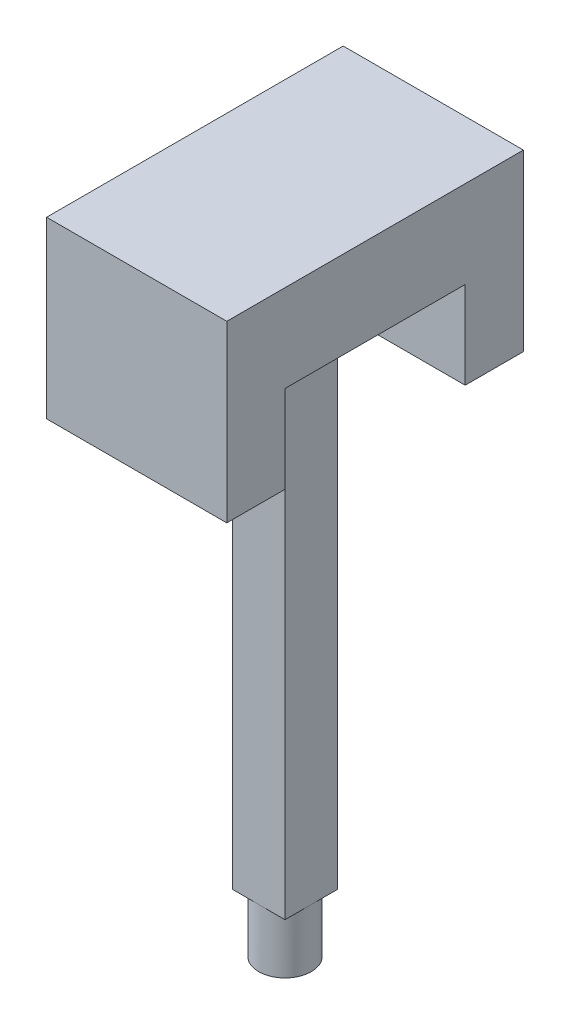
ISO-10303-21;
HEADER;
FILE_DESCRIPTION(('STEP AP214'),'2;1');
FILE_NAME('part.step','',(''),(''),'','','');
FILE_SCHEMA(('AUTOMOTIVE_DESIGN { 1 0 10303 214 1 1 1 1 }'));
ENDSEC;
DATA;
#1=APPLICATION_CONTEXT('core data for automotive mechanical design processes');
#2=APPLICATION_PROTOCOL_DEFINITION('international standard','automotive_design',2000,#1);
#3=PRODUCT_CONTEXT('',#1,'mechanical');
#4=PRODUCT('Part','Part','',(#3));
#5=PRODUCT_RELATED_PRODUCT_CATEGORY('part','',(#4));
#6=PRODUCT_DEFINITION_FORMATION('','',#4);
#7=PRODUCT_DEFINITION_CONTEXT('part definition',#1,'design');
#8=PRODUCT_DEFINITION('design','',#6,#7);
#9=PRODUCT_DEFINITION_SHAPE('','',#8);
#10=(LENGTH_UNIT() NAMED_UNIT(*) SI_UNIT(.MILLI.,.METRE.));
#11=(NAMED_UNIT(*) PLANE_ANGLE_UNIT() SI_UNIT($,.RADIAN.));
#12=(NAMED_UNIT(*) SI_UNIT($,.STERADIAN.) SOLID_ANGLE_UNIT());
#13=UNCERTAINTY_MEASURE_WITH_UNIT(LENGTH_MEASURE(1.E-05),#10,'distance_accuracy_value','');
#14=(GEOMETRIC_REPRESENTATION_CONTEXT(3) GLOBAL_UNCERTAINTY_ASSIGNED_CONTEXT((#13)) GLOBAL_UNIT_ASSIGNED_CONTEXT((#10,
#11,#12)) REPRESENTATION_CONTEXT('',''));
#15=CARTESIAN_POINT('',(0.,0.,0.));
#16=DIRECTION('',(0.,0.,1.));
#17=DIRECTION('',(1.,0.,0.));
#18=AXIS2_PLACEMENT_3D('',#15,#16,#17);
#19=CARTESIAN_POINT('',(0.,15.,0.));
#20=DIRECTION('',(0.,1.,0.));
#21=DIRECTION('',(0.,0.,1.));
#22=AXIS2_PLACEMENT_3D('',#19,#20,#21);
#23=PLANE('',#22);
#24=DIRECTION('',(1.,0.,0.));
#25=VECTOR('',#24,1.);
#26=CARTESIAN_POINT('',(-0.753333333333334,15.,-0.753333333333334));
#27=LINE('',#26,#25);
#28=CARTESIAN_POINT('',(-0.753333333333334,15.,-0.753333333333334));
#29=VERTEX_POINT('',#28);
#30=CARTESIAN_POINT('',(0.753333333333333,15.,-0.753333333333334));
#31=VERTEX_POINT('',#30);
#32=EDGE_CURVE('E230',#29,#31,#27,.T.);
#33=ORIENTED_EDGE('',*,*,#32,.F.);
#34=DIRECTION('',(0.,0.,1.));
#35=VECTOR('',#34,1.);
#36=CARTESIAN_POINT('',(-0.753333333333334,15.,-0.753333333333334));
#37=LINE('',#36,#35);
#38=CARTESIAN_POINT('',(-0.753333333333333,15.,0.753333333333333));
#39=VERTEX_POINT('',#38);
#40=EDGE_CURVE('E222',#29,#39,#37,.T.);
#41=ORIENTED_EDGE('',*,*,#40,.T.);
#42=DIRECTION('',(1.,0.,0.));
#43=VECTOR('',#42,1.);
#44=CARTESIAN_POINT('',(-0.753333333333333,15.,0.753333333333333));
#45=LINE('',#44,#43);
#46=CARTESIAN_POINT('',(0.753333333333333,15.,0.753333333333333));
#47=VERTEX_POINT('',#46);
#48=EDGE_CURVE('E224',#39,#47,#45,.T.);
#49=ORIENTED_EDGE('',*,*,#48,.T.);
#50=DIRECTION('',(0.,0.,1.));
#51=VECTOR('',#50,1.);
#52=CARTESIAN_POINT('',(0.753333333333333,15.,-0.753333333333334));
#53=LINE('',#52,#51);
#54=EDGE_CURVE('E227',#31,#47,#53,.T.);
#55=ORIENTED_EDGE('',*,*,#54,.F.);
#56=EDGE_LOOP('',(#33,#41,#49,#55));
#57=FACE_BOUND('',#56,.T.);
#58=DIRECTION('',(0.,0.,-1.));
#59=VECTOR('',#58,1.);
#60=CARTESIAN_POINT('',(-2.58,15.,0.));
#61=LINE('',#60,#59);
#62=CARTESIAN_POINT('',(-2.58,15.,2.58));
#63=VERTEX_POINT('',#62);
#64=CARTESIAN_POINT('',(-2.58,15.,-2.58));
#65=VERTEX_POINT('',#64);
#66=EDGE_CURVE('E63',#63,#65,#61,.T.);
#67=ORIENTED_EDGE('',*,*,#66,.T.);
#68=DIRECTION('',(1.,0.,0.));
#69=VECTOR('',#68,1.);
#70=CARTESIAN_POINT('',(0.,15.,-2.58));
#71=LINE('',#70,#69);
#72=CARTESIAN_POINT('',(2.58,15.,-2.58));
#73=VERTEX_POINT('',#72);
#74=EDGE_CURVE('E68',#65,#73,#71,.T.);
#75=ORIENTED_EDGE('',*,*,#74,.T.);
#76=DIRECTION('',(0.,0.,-1.));
#77=VECTOR('',#76,1.);
#78=CARTESIAN_POINT('',(2.58,15.,0.));
#79=LINE('',#78,#77);
#80=CARTESIAN_POINT('',(2.58,15.,2.58));
#81=VERTEX_POINT('',#80);
#82=EDGE_CURVE('E155',#81,#73,#79,.T.);
#83=ORIENTED_EDGE('',*,*,#82,.F.);
#84=DIRECTION('',(1.,0.,0.));
#85=VECTOR('',#84,1.);
#86=CARTESIAN_POINT('',(0.,15.,2.58));
#87=LINE('',#86,#85);
#88=EDGE_CURVE('E183',#63,#81,#87,.T.);
#89=ORIENTED_EDGE('',*,*,#88,.F.);
#90=EDGE_LOOP('',(#67,#75,#83,#89));
#91=FACE_BOUND('',#90,.T.);
#92=ADVANCED_FACE('F45',(#57,#91),#23,.F.);
#93=CARTESIAN_POINT('',(0.,0.,0.));
#94=DIRECTION('',(0.,1.,0.));
#95=DIRECTION('',(0.,0.,1.));
#96=AXIS2_PLACEMENT_3D('',#93,#94,#95);
#97=PLANE('',#96);
#98=CARTESIAN_POINT('',(0.,0.,0.));
#99=DIRECTION('',(0.,-1.,0.));
#100=DIRECTION('',(0.,0.,-1.));
#101=AXIS2_PLACEMENT_3D('',#98,#99,#100);
#102=CIRCLE('',#101,0.753333333333333);
#103=CARTESIAN_POINT('',(0.,0.,-0.753333333333333));
#104=VERTEX_POINT('',#103);
#105=CARTESIAN_POINT('',(0.753333333333333,0.,0.));
#106=VERTEX_POINT('',#105);
#107=EDGE_CURVE('E56',#104,#106,#102,.T.);
#108=ORIENTED_EDGE('',*,*,#107,.F.);
#109=DIRECTION('',(1.,0.,0.));
#110=VECTOR('',#109,1.);
#111=CARTESIAN_POINT('',(-0.753333333333334,0.,-0.753333333333334));
#112=LINE('',#111,#110);
#113=CARTESIAN_POINT('',(0.753333333333333,0.,-0.753333333333334));
#114=VERTEX_POINT('',#113);
#115=EDGE_CURVE('E245',#104,#114,#112,.T.);
#116=ORIENTED_EDGE('',*,*,#115,.T.);
#117=DIRECTION('',(0.,0.,1.));
#118=VECTOR('',#117,1.);
#119=CARTESIAN_POINT('',(0.753333333333333,0.,-0.753333333333334));
#120=LINE('',#119,#118);
#121=EDGE_CURVE('E242',#114,#106,#120,.T.);
#122=ORIENTED_EDGE('',*,*,#121,.T.);
#123=EDGE_LOOP('',(#108,#116,#122));
#124=FACE_BOUND('',#123,.T.);
#125=ADVANCED_FACE('F282',(#124),#97,.F.);
#126=CARTESIAN_POINT('',(0.,0.,0.753333333333333));
#127=VERTEX_POINT('',#126);
#128=EDGE_CURVE('E11',#106,#127,#102,.T.);
#129=ORIENTED_EDGE('',*,*,#128,.F.);
#130=CARTESIAN_POINT('',(0.753333333333333,0.,0.753333333333333));
#131=VERTEX_POINT('',#130);
#132=EDGE_CURVE('E241',#106,#131,#120,.T.);
#133=ORIENTED_EDGE('',*,*,#132,.T.);
#134=DIRECTION('',(1.,0.,0.));
#135=VECTOR('',#134,1.);
#136=CARTESIAN_POINT('',(-0.753333333333333,0.,0.753333333333333));
#137=LINE('',#136,#135);
#138=EDGE_CURVE('E237',#127,#131,#137,.T.);
#139=ORIENTED_EDGE('',*,*,#138,.F.);
#140=EDGE_LOOP('',(#129,#133,#139));
#141=FACE_BOUND('',#140,.T.);
#142=ADVANCED_FACE('F270',(#141),#97,.F.);
#143=CARTESIAN_POINT('',(-0.753333333333333,0.,0.));
#144=VERTEX_POINT('',#143);
#145=EDGE_CURVE('E54',#127,#144,#102,.T.);
#146=ORIENTED_EDGE('',*,*,#145,.F.);
#147=CARTESIAN_POINT('',(-0.753333333333333,0.,0.753333333333333));
#148=VERTEX_POINT('',#147);
#149=EDGE_CURVE('E238',#148,#127,#137,.T.);
#150=ORIENTED_EDGE('',*,*,#149,.F.);
#151=DIRECTION('',(0.,0.,1.));
#152=VECTOR('',#151,1.);
#153=CARTESIAN_POINT('',(-0.753333333333334,0.,-0.753333333333334));
#154=LINE('',#153,#152);
#155=EDGE_CURVE('E218',#144,#148,#154,.T.);
#156=ORIENTED_EDGE('',*,*,#155,.F.);
#157=EDGE_LOOP('',(#146,#150,#156));
#158=FACE_BOUND('',#157,.T.);
#159=ADVANCED_FACE('F267',(#158),#97,.F.);
#160=CARTESIAN_POINT('',(-0.753333333333334,15.,-0.753333333333334));
#161=DIRECTION('',(1.,0.,0.));
#162=DIRECTION('',(0.,0.,-1.));
#163=AXIS2_PLACEMENT_3D('',#160,#161,#162);
#164=PLANE('',#163);
#165=CARTESIAN_POINT('',(-0.753333333333334,0.,-0.753333333333334));
#166=VERTEX_POINT('',#165);
#167=EDGE_CURVE('E234',#166,#144,#154,.T.);
#168=ORIENTED_EDGE('',*,*,#167,.T.);
#169=ORIENTED_EDGE('',*,*,#155,.T.);
#170=DIRECTION('',(0.,-1.,0.));
#171=VECTOR('',#170,1.);
#172=CARTESIAN_POINT('',(-0.753333333333333,15.,0.753333333333333));
#173=LINE('',#172,#171);
#174=EDGE_CURVE('E49',#39,#148,#173,.T.);
#175=ORIENTED_EDGE('',*,*,#174,.F.);
#176=ORIENTED_EDGE('',*,*,#40,.F.);
#177=DIRECTION('',(0.,-1.,0.));
#178=VECTOR('',#177,1.);
#179=CARTESIAN_POINT('',(-0.753333333333334,15.,-0.753333333333334));
#180=LINE('',#179,#178);
#181=EDGE_CURVE('E233',#29,#166,#180,.T.);
#182=ORIENTED_EDGE('',*,*,#181,.T.);
#183=EDGE_LOOP('',(#168,#169,#175,#176,#182));
#184=FACE_BOUND('',#183,.T.);
#185=ADVANCED_FACE('F47',(#184),#164,.F.);
#186=CARTESIAN_POINT('',(-0.753333333333333,15.,0.753333333333333));
#187=DIRECTION('',(0.,0.,-1.));
#188=DIRECTION('',(-1.,0.,0.));
#189=AXIS2_PLACEMENT_3D('',#186,#187,#188);
#190=PLANE('',#189);
#191=ORIENTED_EDGE('',*,*,#149,.T.);
#192=ORIENTED_EDGE('',*,*,#138,.T.);
#193=DIRECTION('',(0.,-1.,0.));
#194=VECTOR('',#193,1.);
#195=CARTESIAN_POINT('',(0.753333333333333,15.,0.753333333333333));
#196=LINE('',#195,#194);
#197=EDGE_CURVE('E250',#47,#131,#196,.T.);
#198=ORIENTED_EDGE('',*,*,#197,.F.);
#199=ORIENTED_EDGE('',*,*,#48,.F.);
#200=ORIENTED_EDGE('',*,*,#174,.T.);
#201=EDGE_LOOP('',(#191,#192,#198,#199,#200));
#202=FACE_BOUND('',#201,.T.);
#203=ADVANCED_FACE('F271',(#202),#190,.F.);
#204=CARTESIAN_POINT('',(0.753333333333333,15.,-0.753333333333334));
#205=DIRECTION('',(1.,0.,0.));
#206=DIRECTION('',(0.,0.,-1.));
#207=AXIS2_PLACEMENT_3D('',#204,#205,#206);
#208=PLANE('',#207);
#209=ORIENTED_EDGE('',*,*,#121,.F.);
#210=DIRECTION('',(0.,-1.,0.));
#211=VECTOR('',#210,1.);
#212=CARTESIAN_POINT('',(0.753333333333333,15.,-0.753333333333334));
#213=LINE('',#212,#211);
#214=EDGE_CURVE('E248',#31,#114,#213,.T.);
#215=ORIENTED_EDGE('',*,*,#214,.F.);
#216=ORIENTED_EDGE('',*,*,#54,.T.);
#217=ORIENTED_EDGE('',*,*,#197,.T.);
#218=ORIENTED_EDGE('',*,*,#132,.F.);
#219=EDGE_LOOP('',(#209,#215,#216,#217,#218));
#220=FACE_BOUND('',#219,.T.);
#221=ADVANCED_FACE('F273',(#220),#208,.T.);
#222=CARTESIAN_POINT('',(-0.753333333333334,15.,-0.753333333333334));
#223=DIRECTION('',(0.,0.,-1.));
#224=DIRECTION('',(-1.,0.,0.));
#225=AXIS2_PLACEMENT_3D('',#222,#223,#224);
#226=PLANE('',#225);
#227=EDGE_CURVE('E225',#166,#104,#112,.T.);
#228=ORIENTED_EDGE('',*,*,#227,.F.);
#229=ORIENTED_EDGE('',*,*,#181,.F.);
#230=ORIENTED_EDGE('',*,*,#32,.T.);
#231=ORIENTED_EDGE('',*,*,#214,.T.);
#232=ORIENTED_EDGE('',*,*,#115,.F.);
#233=EDGE_LOOP('',(#228,#229,#230,#231,#232));
#234=FACE_BOUND('',#233,.T.);
#235=ADVANCED_FACE('F278',(#234),#226,.T.);
#236=EDGE_CURVE('E221',#144,#104,#102,.T.);
#237=ORIENTED_EDGE('',*,*,#236,.F.);
#238=ORIENTED_EDGE('',*,*,#167,.F.);
#239=ORIENTED_EDGE('',*,*,#227,.T.);
#240=EDGE_LOOP('',(#237,#238,#239));
#241=FACE_BOUND('',#240,.T.);
#242=ADVANCED_FACE('F292',(#241),#97,.F.);
#243=CARTESIAN_POINT('',(0.,-1.66666666666667,0.));
#244=DIRECTION('',(0.,1.,0.));
#245=DIRECTION('',(0.,0.,1.));
#246=AXIS2_PLACEMENT_3D('',#243,#244,#245);
#247=CYLINDRICAL_SURFACE('',#246,0.753333333333333);
#248=CARTESIAN_POINT('',(0.,-1.66666666666667,0.));
#249=DIRECTION('',(0.,-1.,0.));
#250=DIRECTION('',(0.,0.,-1.));
#251=AXIS2_PLACEMENT_3D('',#248,#249,#250);
#252=CIRCLE('',#251,0.753333333333333);
#253=CARTESIAN_POINT('',(0.,-1.66666666666667,-0.753333333333333));
#254=VERTEX_POINT('',#253);
#255=EDGE_CURVE('E216',#254,#254,#252,.T.);
#256=ORIENTED_EDGE('',*,*,#255,.F.);
#257=EDGE_LOOP('',(#256));
#258=FACE_BOUND('',#257,.T.);
#259=ORIENTED_EDGE('',*,*,#107,.T.);
#260=ORIENTED_EDGE('',*,*,#128,.T.);
#261=ORIENTED_EDGE('',*,*,#145,.T.);
#262=ORIENTED_EDGE('',*,*,#236,.T.);
#263=EDGE_LOOP('',(#259,#260,#261,#262));
#264=FACE_BOUND('',#263,.T.);
#265=ADVANCED_FACE('F262',(#258,#264),#247,.T.);
#266=CARTESIAN_POINT('',(0.,-1.66666666666667,0.));
#267=DIRECTION('',(0.,-1.,0.));
#268=DIRECTION('',(0.,0.,-1.));
#269=AXIS2_PLACEMENT_3D('',#266,#267,#268);
#270=PLANE('',#269);
#271=ORIENTED_EDGE('',*,*,#255,.T.);
#272=EDGE_LOOP('',(#271));
#273=FACE_BOUND('',#272,.T.);
#274=ADVANCED_FACE('F309',(#273),#270,.T.);
#275=CARTESIAN_POINT('',(-2.58,17.5,0.));
#276=DIRECTION('',(-1.,0.,0.));
#277=DIRECTION('',(0.,0.,1.));
#278=AXIS2_PLACEMENT_3D('',#275,#276,#277);
#279=PLANE('',#278);
#280=ORIENTED_EDGE('',*,*,#66,.F.);
#281=DIRECTION('',(0.,1.,0.));
#282=VECTOR('',#281,1.);
#283=CARTESIAN_POINT('',(-2.58,12.5,2.58));
#284=LINE('',#283,#282);
#285=CARTESIAN_POINT('',(-2.58,12.5,2.58));
#286=VERTEX_POINT('',#285);
#287=EDGE_CURVE('E173',#286,#63,#284,.T.);
#288=ORIENTED_EDGE('',*,*,#287,.F.);
#289=DIRECTION('',(0.,0.,1.));
#290=VECTOR('',#289,1.);
#291=CARTESIAN_POINT('',(-2.58,12.5,0.));
#292=LINE('',#291,#290);
#293=CARTESIAN_POINT('',(-2.58,12.5,4.24666666666667));
#294=VERTEX_POINT('',#293);
#295=EDGE_CURVE('E185',#286,#294,#292,.T.);
#296=ORIENTED_EDGE('',*,*,#295,.T.);
#297=DIRECTION('',(0.,-1.,0.));
#298=VECTOR('',#297,1.);
#299=CARTESIAN_POINT('',(-2.58,17.5,4.24666666666667));
#300=LINE('',#299,#298);
#301=CARTESIAN_POINT('',(-2.58,17.5,4.24666666666667));
#302=VERTEX_POINT('',#301);
#303=EDGE_CURVE('E214',#302,#294,#300,.T.);
#304=ORIENTED_EDGE('',*,*,#303,.F.);
#305=DIRECTION('',(0.,0.,-1.));
#306=VECTOR('',#305,1.);
#307=CARTESIAN_POINT('',(-2.58,17.5,0.));
#308=LINE('',#307,#306);
#309=CARTESIAN_POINT('',(-2.58,17.5,-4.24666666666667));
#310=VERTEX_POINT('',#309);
#311=EDGE_CURVE('E196',#302,#310,#308,.T.);
#312=ORIENTED_EDGE('',*,*,#311,.T.);
#313=DIRECTION('',(0.,-1.,0.));
#314=VECTOR('',#313,1.);
#315=CARTESIAN_POINT('',(-2.58,17.5,-4.24666666666667));
#316=LINE('',#315,#314);
#317=CARTESIAN_POINT('',(-2.58,12.5,-4.24666666666667));
#318=VERTEX_POINT('',#317);
#319=EDGE_CURVE('E206',#310,#318,#316,.T.);
#320=ORIENTED_EDGE('',*,*,#319,.T.);
#321=DIRECTION('',(0.,0.,-1.));
#322=VECTOR('',#321,1.);
#323=CARTESIAN_POINT('',(-2.58,12.5,0.));
#324=LINE('',#323,#322);
#325=CARTESIAN_POINT('',(-2.58,12.5,-2.58));
#326=VERTEX_POINT('',#325);
#327=EDGE_CURVE('E159',#326,#318,#324,.T.);
#328=ORIENTED_EDGE('',*,*,#327,.F.);
#329=DIRECTION('',(0.,1.,0.));
#330=VECTOR('',#329,1.);
#331=CARTESIAN_POINT('',(-2.58,12.5,-2.58));
#332=LINE('',#331,#330);
#333=EDGE_CURVE('E158',#326,#65,#332,.T.);
#334=ORIENTED_EDGE('',*,*,#333,.T.);
#335=EDGE_LOOP('',(#280,#288,#296,#304,#312,#320,#328,#334));
#336=FACE_BOUND('',#335,.T.);
#337=ADVANCED_FACE('F306',(#336),#279,.T.);
#338=CARTESIAN_POINT('',(0.,17.5,4.24666666666667));
#339=DIRECTION('',(0.,0.,-1.));
#340=DIRECTION('',(-1.,0.,0.));
#341=AXIS2_PLACEMENT_3D('',#338,#339,#340);
#342=PLANE('',#341);
#343=ORIENTED_EDGE('',*,*,#303,.T.);
#344=DIRECTION('',(1.,0.,0.));
#345=VECTOR('',#344,1.);
#346=CARTESIAN_POINT('',(0.,12.5,4.24666666666667));
#347=LINE('',#346,#345);
#348=CARTESIAN_POINT('',(2.58,12.5,4.24666666666667));
#349=VERTEX_POINT('',#348);
#350=EDGE_CURVE('E188',#294,#349,#347,.T.);
#351=ORIENTED_EDGE('',*,*,#350,.T.);
#352=DIRECTION('',(0.,-1.,0.));
#353=VECTOR('',#352,1.);
#354=CARTESIAN_POINT('',(2.58,17.5,4.24666666666667));
#355=LINE('',#354,#353);
#356=CARTESIAN_POINT('',(2.58,17.5,4.24666666666667));
#357=VERTEX_POINT('',#356);
#358=EDGE_CURVE('E212',#357,#349,#355,.T.);
#359=ORIENTED_EDGE('',*,*,#358,.F.);
#360=DIRECTION('',(1.,0.,0.));
#361=VECTOR('',#360,1.);
#362=CARTESIAN_POINT('',(0.,17.5,4.24666666666667));
#363=LINE('',#362,#361);
#364=EDGE_CURVE('E199',#302,#357,#363,.T.);
#365=ORIENTED_EDGE('',*,*,#364,.F.);
#366=EDGE_LOOP('',(#343,#351,#359,#365));
#367=FACE_BOUND('',#366,.T.);
#368=ADVANCED_FACE('F303',(#367),#342,.F.);
#369=CARTESIAN_POINT('',(2.58,17.5,0.));
#370=DIRECTION('',(-1.,0.,0.));
#371=DIRECTION('',(0.,0.,1.));
#372=AXIS2_PLACEMENT_3D('',#369,#370,#371);
#373=PLANE('',#372);
#374=ORIENTED_EDGE('',*,*,#358,.T.);
#375=DIRECTION('',(0.,0.,1.));
#376=VECTOR('',#375,1.);
#377=CARTESIAN_POINT('',(2.58,12.5,0.));
#378=LINE('',#377,#376);
#379=CARTESIAN_POINT('',(2.58,12.5,2.58));
#380=VERTEX_POINT('',#379);
#381=EDGE_CURVE('E179',#380,#349,#378,.T.);
#382=ORIENTED_EDGE('',*,*,#381,.F.);
#383=DIRECTION('',(0.,1.,0.));
#384=VECTOR('',#383,1.);
#385=CARTESIAN_POINT('',(2.58,12.5,2.58));
#386=LINE('',#385,#384);
#387=EDGE_CURVE('E191',#380,#81,#386,.T.);
#388=ORIENTED_EDGE('',*,*,#387,.T.);
#389=ORIENTED_EDGE('',*,*,#82,.T.);
#390=DIRECTION('',(0.,1.,0.));
#391=VECTOR('',#390,1.);
#392=CARTESIAN_POINT('',(2.58,12.5,-2.58));
#393=LINE('',#392,#391);
#394=CARTESIAN_POINT('',(2.58,12.5,-2.58));
#395=VERTEX_POINT('',#394);
#396=EDGE_CURVE('E150',#395,#73,#393,.T.);
#397=ORIENTED_EDGE('',*,*,#396,.F.);
#398=DIRECTION('',(0.,0.,-1.));
#399=VECTOR('',#398,1.);
#400=CARTESIAN_POINT('',(2.58,12.5,0.));
#401=LINE('',#400,#399);
#402=CARTESIAN_POINT('',(2.58,12.5,-4.24666666666667));
#403=VERTEX_POINT('',#402);
#404=EDGE_CURVE('E154',#395,#403,#401,.T.);
#405=ORIENTED_EDGE('',*,*,#404,.T.);
#406=DIRECTION('',(0.,-1.,0.));
#407=VECTOR('',#406,1.);
#408=CARTESIAN_POINT('',(2.58,17.5,-4.24666666666667));
#409=LINE('',#408,#407);
#410=CARTESIAN_POINT('',(2.58,17.5,-4.24666666666667));
#411=VERTEX_POINT('',#410);
#412=EDGE_CURVE('E210',#411,#403,#409,.T.);
#413=ORIENTED_EDGE('',*,*,#412,.F.);
#414=DIRECTION('',(0.,0.,-1.));
#415=VECTOR('',#414,1.);
#416=CARTESIAN_POINT('',(2.58,17.5,0.));
#417=LINE('',#416,#415);
#418=EDGE_CURVE('E201',#357,#411,#417,.T.);
#419=ORIENTED_EDGE('',*,*,#418,.F.);
#420=EDGE_LOOP('',(#374,#382,#388,#389,#397,#405,#413,#419));
#421=FACE_BOUND('',#420,.T.);
#422=ADVANCED_FACE('F152',(#421),#373,.F.);
#423=CARTESIAN_POINT('',(0.,17.5,-4.24666666666667));
#424=DIRECTION('',(0.,0.,-1.));
#425=DIRECTION('',(-1.,0.,0.));
#426=AXIS2_PLACEMENT_3D('',#423,#424,#425);
#427=PLANE('',#426);
#428=ORIENTED_EDGE('',*,*,#412,.T.);
#429=DIRECTION('',(1.,0.,0.));
#430=VECTOR('',#429,1.);
#431=CARTESIAN_POINT('',(0.,12.5,-4.24666666666667));
#432=LINE('',#431,#430);
#433=EDGE_CURVE('E168',#318,#403,#432,.T.);
#434=ORIENTED_EDGE('',*,*,#433,.F.);
#435=ORIENTED_EDGE('',*,*,#319,.F.);
#436=DIRECTION('',(1.,0.,0.));
#437=VECTOR('',#436,1.);
#438=CARTESIAN_POINT('',(0.,17.5,-4.24666666666667));
#439=LINE('',#438,#437);
#440=EDGE_CURVE('E203',#310,#411,#439,.T.);
#441=ORIENTED_EDGE('',*,*,#440,.T.);
#442=EDGE_LOOP('',(#428,#434,#435,#441));
#443=FACE_BOUND('',#442,.T.);
#444=ADVANCED_FACE('F297',(#443),#427,.T.);
#445=CARTESIAN_POINT('',(0.,17.5,0.));
#446=DIRECTION('',(0.,1.,0.));
#447=DIRECTION('',(0.,0.,1.));
#448=AXIS2_PLACEMENT_3D('',#445,#446,#447);
#449=PLANE('',#448);
#450=ORIENTED_EDGE('',*,*,#311,.F.);
#451=ORIENTED_EDGE('',*,*,#364,.T.);
#452=ORIENTED_EDGE('',*,*,#418,.T.);
#453=ORIENTED_EDGE('',*,*,#440,.F.);
#454=EDGE_LOOP('',(#450,#451,#452,#453));
#455=FACE_BOUND('',#454,.T.);
#456=ADVANCED_FACE('F295',(#455),#449,.T.);
#457=CARTESIAN_POINT('',(0.,12.5,-2.58));
#458=DIRECTION('',(0.,0.,1.));
#459=DIRECTION('',(1.,0.,0.));
#460=AXIS2_PLACEMENT_3D('',#457,#458,#459);
#461=PLANE('',#460);
#462=ORIENTED_EDGE('',*,*,#74,.F.);
#463=ORIENTED_EDGE('',*,*,#333,.F.);
#464=DIRECTION('',(1.,0.,0.));
#465=VECTOR('',#464,1.);
#466=CARTESIAN_POINT('',(0.,12.5,-2.58));
#467=LINE('',#466,#465);
#468=EDGE_CURVE('E166',#326,#395,#467,.T.);
#469=ORIENTED_EDGE('',*,*,#468,.T.);
#470=ORIENTED_EDGE('',*,*,#396,.T.);
#471=EDGE_LOOP('',(#462,#463,#469,#470));
#472=FACE_BOUND('',#471,.T.);
#473=ADVANCED_FACE('F170',(#472),#461,.T.);
#474=CARTESIAN_POINT('',(0.,12.5,0.));
#475=DIRECTION('',(0.,1.,0.));
#476=DIRECTION('',(0.,0.,1.));
#477=AXIS2_PLACEMENT_3D('',#474,#475,#476);
#478=PLANE('',#477);
#479=ORIENTED_EDGE('',*,*,#468,.F.);
#480=ORIENTED_EDGE('',*,*,#327,.T.);
#481=ORIENTED_EDGE('',*,*,#433,.T.);
#482=ORIENTED_EDGE('',*,*,#404,.F.);
#483=EDGE_LOOP('',(#479,#480,#481,#482));
#484=FACE_BOUND('',#483,.T.);
#485=ADVANCED_FACE('F164',(#484),#478,.F.);
#486=CARTESIAN_POINT('',(0.,12.5,2.58));
#487=DIRECTION('',(0.,0.,1.));
#488=DIRECTION('',(1.,0.,0.));
#489=AXIS2_PLACEMENT_3D('',#486,#487,#488);
#490=PLANE('',#489);
#491=ORIENTED_EDGE('',*,*,#88,.T.);
#492=ORIENTED_EDGE('',*,*,#387,.F.);
#493=DIRECTION('',(1.,0.,0.));
#494=VECTOR('',#493,1.);
#495=CARTESIAN_POINT('',(0.,12.5,2.58));
#496=LINE('',#495,#494);
#497=EDGE_CURVE('E182',#286,#380,#496,.T.);
#498=ORIENTED_EDGE('',*,*,#497,.F.);
#499=ORIENTED_EDGE('',*,*,#287,.T.);
#500=EDGE_LOOP('',(#491,#492,#498,#499));
#501=FACE_BOUND('',#500,.T.);
#502=ADVANCED_FACE('F413',(#501),#490,.F.);
#503=CARTESIAN_POINT('',(0.,12.5,0.));
#504=DIRECTION('',(0.,1.,0.));
#505=DIRECTION('',(0.,0.,1.));
#506=AXIS2_PLACEMENT_3D('',#503,#504,#505);
#507=PLANE('',#506);
#508=ORIENTED_EDGE('',*,*,#381,.T.);
#509=ORIENTED_EDGE('',*,*,#350,.F.);
#510=ORIENTED_EDGE('',*,*,#295,.F.);
#511=ORIENTED_EDGE('',*,*,#497,.T.);
#512=EDGE_LOOP('',(#508,#509,#510,#511));
#513=FACE_BOUND('',#512,.T.);
#514=ADVANCED_FACE('F422',(#513),#507,.F.);
#515=CLOSED_SHELL('',(#92,#125,#142,#159,#185,#203,#221,#235,#242,#265,#274,#337,#368,#422,#444,
#456,#473,#485,#502,#514));
#516=MANIFOLD_SOLID_BREP('B2',#515);
#517=ADVANCED_BREP_SHAPE_REPRESENTATION('',(#18,#516),#14);
#518=SHAPE_DEFINITION_REPRESENTATION(#9,#517);
ENDSEC;
END-ISO-10303-21;
